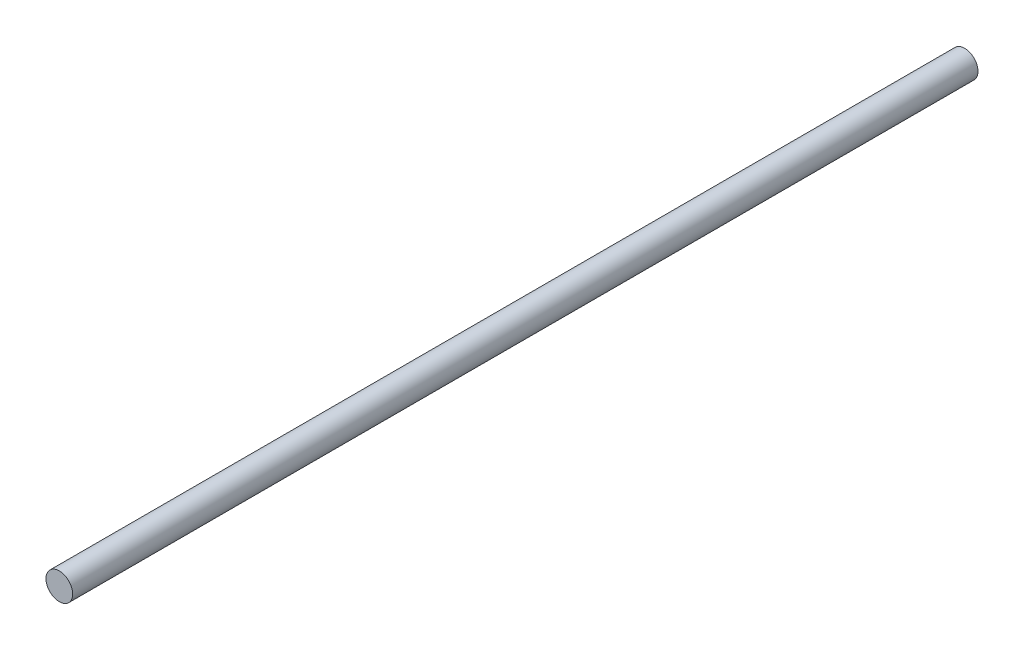
ISO-10303-21;
HEADER;
FILE_DESCRIPTION(('STEP AP214'),'2;1');
FILE_NAME('part.step','',(''),(''),'','','');
FILE_SCHEMA(('AUTOMOTIVE_DESIGN { 1 0 10303 214 1 1 1 1 }'));
ENDSEC;
DATA;
#1=APPLICATION_CONTEXT('core data for automotive mechanical design processes');
#2=APPLICATION_PROTOCOL_DEFINITION('international standard','automotive_design',2000,#1);
#3=PRODUCT_CONTEXT('',#1,'mechanical');
#4=PRODUCT('Part','Part','',(#3));
#5=PRODUCT_RELATED_PRODUCT_CATEGORY('part','',(#4));
#6=PRODUCT_DEFINITION_FORMATION('','',#4);
#7=PRODUCT_DEFINITION_CONTEXT('part definition',#1,'design');
#8=PRODUCT_DEFINITION('design','',#6,#7);
#9=PRODUCT_DEFINITION_SHAPE('','',#8);
#10=(LENGTH_UNIT() NAMED_UNIT(*) SI_UNIT(.MILLI.,.METRE.));
#11=(NAMED_UNIT(*) PLANE_ANGLE_UNIT() SI_UNIT($,.RADIAN.));
#12=(NAMED_UNIT(*) SI_UNIT($,.STERADIAN.) SOLID_ANGLE_UNIT());
#13=UNCERTAINTY_MEASURE_WITH_UNIT(LENGTH_MEASURE(1.E-05),#10,'distance_accuracy_value','');
#14=(GEOMETRIC_REPRESENTATION_CONTEXT(3) GLOBAL_UNCERTAINTY_ASSIGNED_CONTEXT((#13)) GLOBAL_UNIT_ASSIGNED_CONTEXT((#10,
#11,#12)) REPRESENTATION_CONTEXT('',''));
#15=CARTESIAN_POINT('',(0.,0.,0.));
#16=DIRECTION('',(0.,0.,1.));
#17=DIRECTION('',(1.,0.,0.));
#18=AXIS2_PLACEMENT_3D('',#15,#16,#17);
#19=CARTESIAN_POINT('',(-3.719,5.173,11.731));
#20=DIRECTION('',(0.,0.,-1.));
#21=DIRECTION('',(-1.,0.,0.));
#22=AXIS2_PLACEMENT_3D('',#19,#20,#21);
#23=CYLINDRICAL_SURFACE('',#22,0.173);
#24=CARTESIAN_POINT('',(-3.719,5.173,11.731));
#25=DIRECTION('',(0.,0.,1.));
#26=DIRECTION('',(1.,0.,0.));
#27=AXIS2_PLACEMENT_3D('',#24,#25,#26);
#28=CIRCLE('',#27,0.173);
#29=CARTESIAN_POINT('',(-3.546,5.173,11.731));
#30=VERTEX_POINT('',#29);
#31=EDGE_CURVE('E10',#30,#30,#28,.T.);
#32=ORIENTED_EDGE('',*,*,#31,.F.);
#33=EDGE_LOOP('',(#32));
#34=FACE_BOUND('',#33,.T.);
#35=CARTESIAN_POINT('',(-3.719,5.173,0.));
#36=DIRECTION('',(0.,0.,1.));
#37=DIRECTION('',(1.,0.,0.));
#38=AXIS2_PLACEMENT_3D('',#35,#36,#37);
#39=CIRCLE('',#38,0.173);
#40=CARTESIAN_POINT('',(-3.546,5.173,0.));
#41=VERTEX_POINT('',#40);
#42=EDGE_CURVE('E45',#41,#41,#39,.T.);
#43=ORIENTED_EDGE('',*,*,#42,.T.);
#44=EDGE_LOOP('',(#43));
#45=FACE_BOUND('',#44,.T.);
#46=ADVANCED_FACE('F39',(#34,#45),#23,.T.);
#47=CARTESIAN_POINT('',(-3.719,5.173,11.731));
#48=DIRECTION('',(0.,0.,1.));
#49=DIRECTION('',(1.,0.,0.));
#50=AXIS2_PLACEMENT_3D('',#47,#48,#49);
#51=PLANE('',#50);
#52=ORIENTED_EDGE('',*,*,#31,.T.);
#53=EDGE_LOOP('',(#52));
#54=FACE_BOUND('',#53,.T.);
#55=ADVANCED_FACE('F53',(#54),#51,.T.);
#56=CARTESIAN_POINT('',(-3.719,5.173,0.));
#57=DIRECTION('',(0.,0.,1.));
#58=DIRECTION('',(1.,0.,0.));
#59=AXIS2_PLACEMENT_3D('',#56,#57,#58);
#60=PLANE('',#59);
#61=ORIENTED_EDGE('',*,*,#42,.F.);
#62=EDGE_LOOP('',(#61));
#63=FACE_BOUND('',#62,.T.);
#64=ADVANCED_FACE('F55',(#63),#60,.F.);
#65=CLOSED_SHELL('',(#46,#55,#64));
#66=MANIFOLD_SOLID_BREP('B2',#65);
#67=ADVANCED_BREP_SHAPE_REPRESENTATION('',(#18,#66),#14);
#68=SHAPE_DEFINITION_REPRESENTATION(#9,#67);
ENDSEC;
END-ISO-10303-21;
